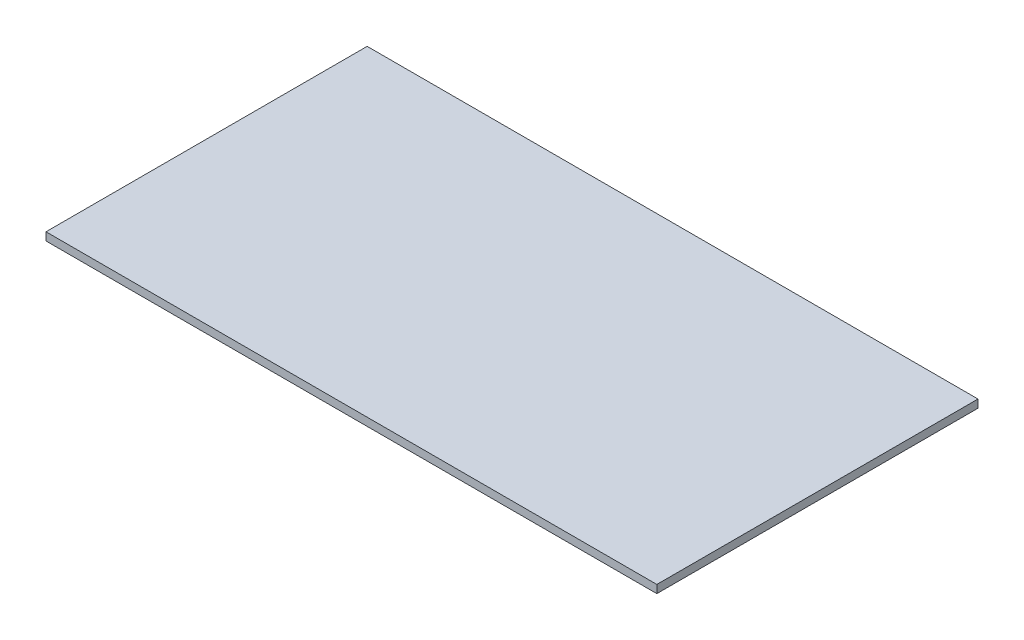
ISO-10303-21;
HEADER;
FILE_DESCRIPTION(('STEP AP214'),'2;1');
FILE_NAME('part.step','',(''),(''),'','','');
FILE_SCHEMA(('AUTOMOTIVE_DESIGN { 1 0 10303 214 1 1 1 1 }'));
ENDSEC;
DATA;
#1=APPLICATION_CONTEXT('core data for automotive mechanical design processes');
#2=APPLICATION_PROTOCOL_DEFINITION('international standard','automotive_design',2000,#1);
#3=PRODUCT_CONTEXT('',#1,'mechanical');
#4=PRODUCT('Part','Part','',(#3));
#5=PRODUCT_RELATED_PRODUCT_CATEGORY('part','',(#4));
#6=PRODUCT_DEFINITION_FORMATION('','',#4);
#7=PRODUCT_DEFINITION_CONTEXT('part definition',#1,'design');
#8=PRODUCT_DEFINITION('design','',#6,#7);
#9=PRODUCT_DEFINITION_SHAPE('','',#8);
#10=(LENGTH_UNIT() NAMED_UNIT(*) SI_UNIT(.MILLI.,.METRE.));
#11=(NAMED_UNIT(*) PLANE_ANGLE_UNIT() SI_UNIT($,.RADIAN.));
#12=(NAMED_UNIT(*) SI_UNIT($,.STERADIAN.) SOLID_ANGLE_UNIT());
#13=UNCERTAINTY_MEASURE_WITH_UNIT(LENGTH_MEASURE(1.E-05),#10,'distance_accuracy_value','');
#14=(GEOMETRIC_REPRESENTATION_CONTEXT(3) GLOBAL_UNCERTAINTY_ASSIGNED_CONTEXT((#13)) GLOBAL_UNIT_ASSIGNED_CONTEXT((#10,
#11,#12)) REPRESENTATION_CONTEXT('',''));
#15=CARTESIAN_POINT('',(0.,0.,0.));
#16=DIRECTION('',(0.,0.,1.));
#17=DIRECTION('',(1.,0.,0.));
#18=AXIS2_PLACEMENT_3D('',#15,#16,#17);
#19=CARTESIAN_POINT('',(0.,6.35,0.));
#20=DIRECTION('',(1.,0.,0.));
#21=DIRECTION('',(0.,0.,-1.));
#22=AXIS2_PLACEMENT_3D('',#19,#20,#21);
#23=PLANE('',#22);
#24=DIRECTION('',(0.,0.,1.));
#25=VECTOR('',#24,1.);
#26=CARTESIAN_POINT('',(0.,0.,0.));
#27=LINE('',#26,#25);
#28=CARTESIAN_POINT('',(0.,0.,-255.));
#29=VERTEX_POINT('',#28);
#30=CARTESIAN_POINT('',(0.,0.,0.));
#31=VERTEX_POINT('',#30);
#32=EDGE_CURVE('E102',#29,#31,#27,.T.);
#33=ORIENTED_EDGE('',*,*,#32,.T.);
#34=DIRECTION('',(0.,-1.,0.));
#35=VECTOR('',#34,1.);
#36=CARTESIAN_POINT('',(0.,6.35,0.));
#37=LINE('',#36,#35);
#38=CARTESIAN_POINT('',(0.,6.35,0.));
#39=VERTEX_POINT('',#38);
#40=EDGE_CURVE('E11',#39,#31,#37,.T.);
#41=ORIENTED_EDGE('',*,*,#40,.F.);
#42=DIRECTION('',(0.,0.,1.));
#43=VECTOR('',#42,1.);
#44=CARTESIAN_POINT('',(0.,6.35,0.));
#45=LINE('',#44,#43);
#46=CARTESIAN_POINT('',(0.,6.35,-255.));
#47=VERTEX_POINT('',#46);
#48=EDGE_CURVE('E90',#47,#39,#45,.T.);
#49=ORIENTED_EDGE('',*,*,#48,.F.);
#50=DIRECTION('',(0.,-1.,0.));
#51=VECTOR('',#50,1.);
#52=CARTESIAN_POINT('',(0.,6.35,-255.));
#53=LINE('',#52,#51);
#54=EDGE_CURVE('E98',#47,#29,#53,.T.);
#55=ORIENTED_EDGE('',*,*,#54,.T.);
#56=EDGE_LOOP('',(#33,#41,#49,#55));
#57=FACE_BOUND('',#56,.T.);
#58=ADVANCED_FACE('F39',(#57),#23,.F.);
#59=CARTESIAN_POINT('',(0.,6.35,0.));
#60=DIRECTION('',(0.,0.,-1.));
#61=DIRECTION('',(-1.,0.,0.));
#62=AXIS2_PLACEMENT_3D('',#59,#60,#61);
#63=PLANE('',#62);
#64=DIRECTION('',(1.,0.,0.));
#65=VECTOR('',#64,1.);
#66=CARTESIAN_POINT('',(0.,0.,0.));
#67=LINE('',#66,#65);
#68=CARTESIAN_POINT('',(485.,0.,0.));
#69=VERTEX_POINT('',#68);
#70=EDGE_CURVE('E94',#31,#69,#67,.T.);
#71=ORIENTED_EDGE('',*,*,#70,.T.);
#72=DIRECTION('',(0.,-1.,0.));
#73=VECTOR('',#72,1.);
#74=CARTESIAN_POINT('',(485.,6.35,0.));
#75=LINE('',#74,#73);
#76=CARTESIAN_POINT('',(485.,6.35,0.));
#77=VERTEX_POINT('',#76);
#78=EDGE_CURVE('E47',#77,#69,#75,.T.);
#79=ORIENTED_EDGE('',*,*,#78,.F.);
#80=DIRECTION('',(1.,0.,0.));
#81=VECTOR('',#80,1.);
#82=CARTESIAN_POINT('',(0.,6.35,0.));
#83=LINE('',#82,#81);
#84=EDGE_CURVE('E85',#39,#77,#83,.T.);
#85=ORIENTED_EDGE('',*,*,#84,.F.);
#86=ORIENTED_EDGE('',*,*,#40,.T.);
#87=EDGE_LOOP('',(#71,#79,#85,#86));
#88=FACE_BOUND('',#87,.T.);
#89=ADVANCED_FACE('F93',(#88),#63,.F.);
#90=CARTESIAN_POINT('',(485.,6.35,0.));
#91=DIRECTION('',(-1.,0.,0.));
#92=DIRECTION('',(0.,0.,1.));
#93=AXIS2_PLACEMENT_3D('',#90,#91,#92);
#94=PLANE('',#93);
#95=DIRECTION('',(0.,0.,-1.));
#96=VECTOR('',#95,1.);
#97=CARTESIAN_POINT('',(485.,0.,0.));
#98=LINE('',#97,#96);
#99=CARTESIAN_POINT('',(485.,0.,-255.));
#100=VERTEX_POINT('',#99);
#101=EDGE_CURVE('E72',#69,#100,#98,.T.);
#102=ORIENTED_EDGE('',*,*,#101,.T.);
#103=DIRECTION('',(0.,-1.,0.));
#104=VECTOR('',#103,1.);
#105=CARTESIAN_POINT('',(485.,6.35,-255.));
#106=LINE('',#105,#104);
#107=CARTESIAN_POINT('',(485.,6.35,-255.));
#108=VERTEX_POINT('',#107);
#109=EDGE_CURVE('E95',#108,#100,#106,.T.);
#110=ORIENTED_EDGE('',*,*,#109,.F.);
#111=DIRECTION('',(0.,0.,-1.));
#112=VECTOR('',#111,1.);
#113=CARTESIAN_POINT('',(485.,6.35,0.));
#114=LINE('',#113,#112);
#115=EDGE_CURVE('E88',#77,#108,#114,.T.);
#116=ORIENTED_EDGE('',*,*,#115,.F.);
#117=ORIENTED_EDGE('',*,*,#78,.T.);
#118=EDGE_LOOP('',(#102,#110,#116,#117));
#119=FACE_BOUND('',#118,.T.);
#120=ADVANCED_FACE('F96',(#119),#94,.F.);
#121=CARTESIAN_POINT('',(0.,6.35,-255.));
#122=DIRECTION('',(0.,0.,1.));
#123=DIRECTION('',(1.,0.,0.));
#124=AXIS2_PLACEMENT_3D('',#121,#122,#123);
#125=PLANE('',#124);
#126=DIRECTION('',(-1.,0.,0.));
#127=VECTOR('',#126,1.);
#128=CARTESIAN_POINT('',(0.,0.,-255.));
#129=LINE('',#128,#127);
#130=EDGE_CURVE('E78',#100,#29,#129,.T.);
#131=ORIENTED_EDGE('',*,*,#130,.T.);
#132=ORIENTED_EDGE('',*,*,#54,.F.);
#133=DIRECTION('',(-1.,0.,0.));
#134=VECTOR('',#133,1.);
#135=CARTESIAN_POINT('',(0.,6.35,-255.));
#136=LINE('',#135,#134);
#137=EDGE_CURVE('E55',#108,#47,#136,.T.);
#138=ORIENTED_EDGE('',*,*,#137,.F.);
#139=ORIENTED_EDGE('',*,*,#109,.T.);
#140=EDGE_LOOP('',(#131,#132,#138,#139));
#141=FACE_BOUND('',#140,.T.);
#142=ADVANCED_FACE('F109',(#141),#125,.F.);
#143=CARTESIAN_POINT('',(0.,6.35,0.));
#144=DIRECTION('',(0.,-1.,0.));
#145=DIRECTION('',(0.,0.,-1.));
#146=AXIS2_PLACEMENT_3D('',#143,#144,#145);
#147=PLANE('',#146);
#148=ORIENTED_EDGE('',*,*,#48,.T.);
#149=ORIENTED_EDGE('',*,*,#84,.T.);
#150=ORIENTED_EDGE('',*,*,#115,.T.);
#151=ORIENTED_EDGE('',*,*,#137,.T.);
#152=EDGE_LOOP('',(#148,#149,#150,#151));
#153=FACE_BOUND('',#152,.T.);
#154=ADVANCED_FACE('F86',(#153),#147,.F.);
#155=CARTESIAN_POINT('',(0.,0.,0.));
#156=DIRECTION('',(0.,-1.,0.));
#157=DIRECTION('',(0.,0.,-1.));
#158=AXIS2_PLACEMENT_3D('',#155,#156,#157);
#159=PLANE('',#158);
#160=ORIENTED_EDGE('',*,*,#32,.F.);
#161=ORIENTED_EDGE('',*,*,#130,.F.);
#162=ORIENTED_EDGE('',*,*,#101,.F.);
#163=ORIENTED_EDGE('',*,*,#70,.F.);
#164=EDGE_LOOP('',(#160,#161,#162,#163));
#165=FACE_BOUND('',#164,.T.);
#166=ADVANCED_FACE('F112',(#165),#159,.T.);
#167=CLOSED_SHELL('',(#58,#89,#120,#142,#154,#166));
#168=MANIFOLD_SOLID_BREP('B2',#167);
#169=ADVANCED_BREP_SHAPE_REPRESENTATION('',(#18,#168),#14);
#170=SHAPE_DEFINITION_REPRESENTATION(#9,#169);
ENDSEC;
END-ISO-10303-21;
